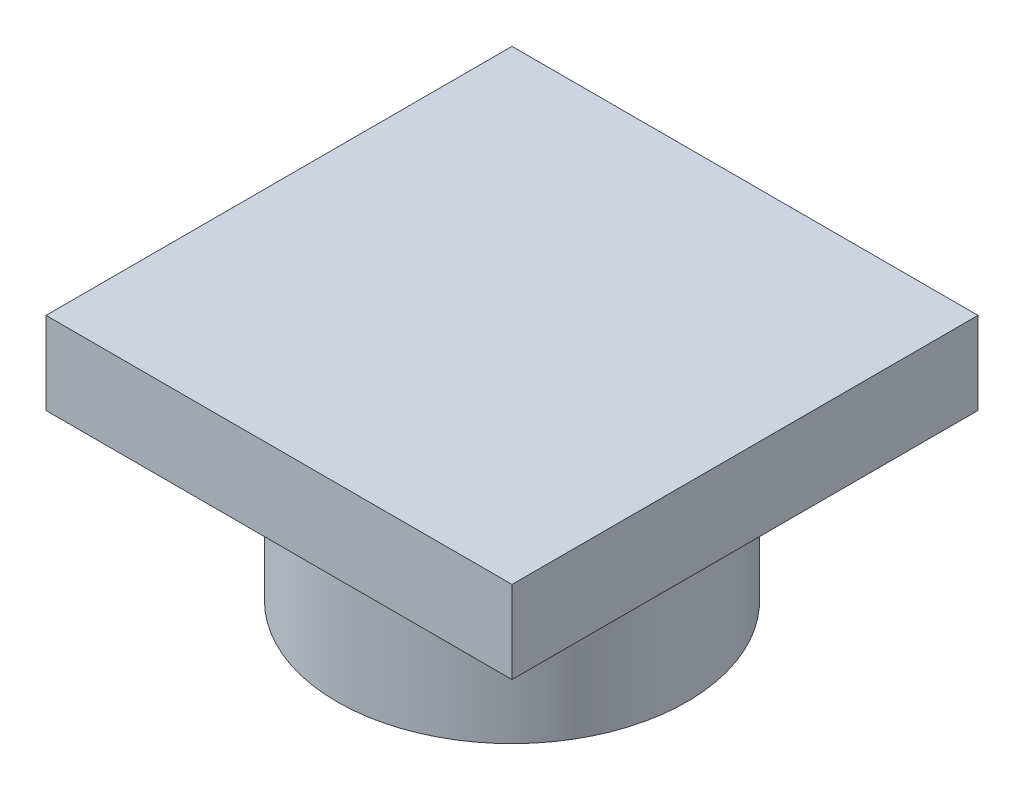
ISO-10303-21;
HEADER;
FILE_DESCRIPTION(('STEP AP214'),'2;1');
FILE_NAME('part.step','',(''),(''),'','','');
FILE_SCHEMA(('AUTOMOTIVE_DESIGN { 1 0 10303 214 1 1 1 1 }'));
ENDSEC;
DATA;
#1=APPLICATION_CONTEXT('core data for automotive mechanical design processes');
#2=APPLICATION_PROTOCOL_DEFINITION('international standard','automotive_design',2000,#1);
#3=PRODUCT_CONTEXT('',#1,'mechanical');
#4=PRODUCT('Part','Part','',(#3));
#5=PRODUCT_RELATED_PRODUCT_CATEGORY('part','',(#4));
#6=PRODUCT_DEFINITION_FORMATION('','',#4);
#7=PRODUCT_DEFINITION_CONTEXT('part definition',#1,'design');
#8=PRODUCT_DEFINITION('design','',#6,#7);
#9=PRODUCT_DEFINITION_SHAPE('','',#8);
#10=(LENGTH_UNIT() NAMED_UNIT(*) SI_UNIT(.MILLI.,.METRE.));
#11=(NAMED_UNIT(*) PLANE_ANGLE_UNIT() SI_UNIT($,.RADIAN.));
#12=(NAMED_UNIT(*) SI_UNIT($,.STERADIAN.) SOLID_ANGLE_UNIT());
#13=UNCERTAINTY_MEASURE_WITH_UNIT(LENGTH_MEASURE(1.E-05),#10,'distance_accuracy_value','');
#14=(GEOMETRIC_REPRESENTATION_CONTEXT(3) GLOBAL_UNCERTAINTY_ASSIGNED_CONTEXT((#13)) GLOBAL_UNIT_ASSIGNED_CONTEXT((#10,
#11,#12)) REPRESENTATION_CONTEXT('',''));
#15=CARTESIAN_POINT('',(0.,0.,0.));
#16=DIRECTION('',(0.,0.,1.));
#17=DIRECTION('',(1.,0.,0.));
#18=AXIS2_PLACEMENT_3D('',#15,#16,#17);
#19=CARTESIAN_POINT('',(0.,4.,0.));
#20=DIRECTION('',(0.,-1.,0.));
#21=DIRECTION('',(0.,0.,-1.));
#22=AXIS2_PLACEMENT_3D('',#19,#20,#21);
#23=CYLINDRICAL_SURFACE('',#22,4.25);
#24=CARTESIAN_POINT('',(0.,4.,0.));
#25=DIRECTION('',(0.,1.,0.));
#26=DIRECTION('',(0.,0.,1.));
#27=AXIS2_PLACEMENT_3D('',#24,#25,#26);
#28=CIRCLE('',#27,4.25);
#29=CARTESIAN_POINT('',(0.,4.,4.25));
#30=VERTEX_POINT('',#29);
#31=EDGE_CURVE('E11',#30,#30,#28,.T.);
#32=ORIENTED_EDGE('',*,*,#31,.F.);
#33=EDGE_LOOP('',(#32));
#34=FACE_BOUND('',#33,.T.);
#35=CARTESIAN_POINT('',(0.,0.,0.));
#36=DIRECTION('',(0.,1.,0.));
#37=DIRECTION('',(0.,0.,1.));
#38=AXIS2_PLACEMENT_3D('',#35,#36,#37);
#39=CIRCLE('',#38,4.25);
#40=CARTESIAN_POINT('',(0.,0.,4.25));
#41=VERTEX_POINT('',#40);
#42=EDGE_CURVE('E44',#41,#41,#39,.T.);
#43=ORIENTED_EDGE('',*,*,#42,.T.);
#44=EDGE_LOOP('',(#43));
#45=FACE_BOUND('',#44,.T.);
#46=ADVANCED_FACE('F41',(#34,#45),#23,.T.);
#47=CARTESIAN_POINT('',(0.,0.,0.));
#48=DIRECTION('',(0.,1.,0.));
#49=DIRECTION('',(0.,0.,1.));
#50=AXIS2_PLACEMENT_3D('',#47,#48,#49);
#51=PLANE('',#50);
#52=ORIENTED_EDGE('',*,*,#42,.F.);
#53=EDGE_LOOP('',(#52));
#54=FACE_BOUND('',#53,.T.);
#55=ADVANCED_FACE('F133',(#54),#51,.F.);
#56=CARTESIAN_POINT('',(0.,6.,5.65685424949241));
#57=DIRECTION('',(0.,0.,-1.));
#58=DIRECTION('',(-1.,0.,0.));
#59=AXIS2_PLACEMENT_3D('',#56,#57,#58);
#60=PLANE('',#59);
#61=DIRECTION('',(1.,0.,0.));
#62=VECTOR('',#61,1.);
#63=CARTESIAN_POINT('',(0.,4.,5.65685424949241));
#64=LINE('',#63,#62);
#65=CARTESIAN_POINT('',(-5.65685424949235,4.,5.65685424949241));
#66=VERTEX_POINT('',#65);
#67=CARTESIAN_POINT('',(5.65685424949238,4.,5.65685424949241));
#68=VERTEX_POINT('',#67);
#69=EDGE_CURVE('E112',#66,#68,#64,.T.);
#70=ORIENTED_EDGE('',*,*,#69,.T.);
#71=DIRECTION('',(0.,-1.,0.));
#72=VECTOR('',#71,1.);
#73=CARTESIAN_POINT('',(5.65685424949238,6.,5.65685424949241));
#74=LINE('',#73,#72);
#75=CARTESIAN_POINT('',(5.65685424949238,6.,5.65685424949241));
#76=VERTEX_POINT('',#75);
#77=EDGE_CURVE('E98',#76,#68,#74,.T.);
#78=ORIENTED_EDGE('',*,*,#77,.F.);
#79=DIRECTION('',(1.,0.,0.));
#80=VECTOR('',#79,1.);
#81=CARTESIAN_POINT('',(0.,6.,5.65685424949241));
#82=LINE('',#81,#80);
#83=CARTESIAN_POINT('',(-5.65685424949235,6.,5.65685424949241));
#84=VERTEX_POINT('',#83);
#85=EDGE_CURVE('E82',#84,#76,#82,.T.);
#86=ORIENTED_EDGE('',*,*,#85,.F.);
#87=DIRECTION('',(0.,-1.,0.));
#88=VECTOR('',#87,1.);
#89=CARTESIAN_POINT('',(-5.65685424949235,6.,5.65685424949241));
#90=LINE('',#89,#88);
#91=EDGE_CURVE('E108',#84,#66,#90,.T.);
#92=ORIENTED_EDGE('',*,*,#91,.T.);
#93=EDGE_LOOP('',(#70,#78,#86,#92));
#94=FACE_BOUND('',#93,.T.);
#95=ADVANCED_FACE('F135',(#94),#60,.F.);
#96=CARTESIAN_POINT('',(5.65685424949238,6.,0.));
#97=DIRECTION('',(1.,0.,0.));
#98=DIRECTION('',(0.,0.,-1.));
#99=AXIS2_PLACEMENT_3D('',#96,#97,#98);
#100=PLANE('',#99);
#101=DIRECTION('',(0.,0.,1.));
#102=VECTOR('',#101,1.);
#103=CARTESIAN_POINT('',(5.65685424949238,4.,0.));
#104=LINE('',#103,#102);
#105=CARTESIAN_POINT('',(5.65685424949238,4.,-5.65685424949238));
#106=VERTEX_POINT('',#105);
#107=EDGE_CURVE('E92',#106,#68,#104,.T.);
#108=ORIENTED_EDGE('',*,*,#107,.F.);
#109=DIRECTION('',(0.,-1.,0.));
#110=VECTOR('',#109,1.);
#111=CARTESIAN_POINT('',(5.65685424949238,6.,-5.65685424949238));
#112=LINE('',#111,#110);
#113=CARTESIAN_POINT('',(5.65685424949238,6.,-5.65685424949238));
#114=VERTEX_POINT('',#113);
#115=EDGE_CURVE('E88',#114,#106,#112,.T.);
#116=ORIENTED_EDGE('',*,*,#115,.F.);
#117=DIRECTION('',(0.,0.,1.));
#118=VECTOR('',#117,1.);
#119=CARTESIAN_POINT('',(5.65685424949238,6.,0.));
#120=LINE('',#119,#118);
#121=EDGE_CURVE('E90',#114,#76,#120,.T.);
#122=ORIENTED_EDGE('',*,*,#121,.T.);
#123=ORIENTED_EDGE('',*,*,#77,.T.);
#124=EDGE_LOOP('',(#108,#116,#122,#123));
#125=FACE_BOUND('',#124,.T.);
#126=ADVANCED_FACE('F89',(#125),#100,.T.);
#127=CARTESIAN_POINT('',(0.,6.,-5.65685424949238));
#128=DIRECTION('',(0.,0.,-1.));
#129=DIRECTION('',(-1.,0.,0.));
#130=AXIS2_PLACEMENT_3D('',#127,#128,#129);
#131=PLANE('',#130);
#132=DIRECTION('',(1.,0.,0.));
#133=VECTOR('',#132,1.);
#134=CARTESIAN_POINT('',(0.,4.,-5.65685424949238));
#135=LINE('',#134,#133);
#136=CARTESIAN_POINT('',(-5.65685424949235,4.,-5.65685424949238));
#137=VERTEX_POINT('',#136);
#138=EDGE_CURVE('E118',#137,#106,#135,.T.);
#139=ORIENTED_EDGE('',*,*,#138,.F.);
#140=DIRECTION('',(0.,-1.,0.));
#141=VECTOR('',#140,1.);
#142=CARTESIAN_POINT('',(-5.65685424949235,6.,-5.65685424949238));
#143=LINE('',#142,#141);
#144=CARTESIAN_POINT('',(-5.65685424949235,6.,-5.65685424949238));
#145=VERTEX_POINT('',#144);
#146=EDGE_CURVE('E74',#145,#137,#143,.T.);
#147=ORIENTED_EDGE('',*,*,#146,.F.);
#148=DIRECTION('',(1.,0.,0.));
#149=VECTOR('',#148,1.);
#150=CARTESIAN_POINT('',(0.,6.,-5.65685424949238));
#151=LINE('',#150,#149);
#152=EDGE_CURVE('E101',#145,#114,#151,.T.);
#153=ORIENTED_EDGE('',*,*,#152,.T.);
#154=ORIENTED_EDGE('',*,*,#115,.T.);
#155=EDGE_LOOP('',(#139,#147,#153,#154));
#156=FACE_BOUND('',#155,.T.);
#157=ADVANCED_FACE('F104',(#156),#131,.T.);
#158=CARTESIAN_POINT('',(-5.65685424949235,6.,0.));
#159=DIRECTION('',(1.,0.,0.));
#160=DIRECTION('',(0.,0.,-1.));
#161=AXIS2_PLACEMENT_3D('',#158,#159,#160);
#162=PLANE('',#161);
#163=DIRECTION('',(0.,0.,1.));
#164=VECTOR('',#163,1.);
#165=CARTESIAN_POINT('',(-5.65685424949235,4.,0.));
#166=LINE('',#165,#164);
#167=EDGE_CURVE('E77',#137,#66,#166,.T.);
#168=ORIENTED_EDGE('',*,*,#167,.T.);
#169=ORIENTED_EDGE('',*,*,#91,.F.);
#170=DIRECTION('',(0.,0.,1.));
#171=VECTOR('',#170,1.);
#172=CARTESIAN_POINT('',(-5.65685424949235,6.,0.));
#173=LINE('',#172,#171);
#174=EDGE_CURVE('E58',#145,#84,#173,.T.);
#175=ORIENTED_EDGE('',*,*,#174,.F.);
#176=ORIENTED_EDGE('',*,*,#146,.T.);
#177=EDGE_LOOP('',(#168,#169,#175,#176));
#178=FACE_BOUND('',#177,.T.);
#179=ADVANCED_FACE('F148',(#178),#162,.F.);
#180=CARTESIAN_POINT('',(0.,6.,0.));
#181=DIRECTION('',(0.,1.,0.));
#182=DIRECTION('',(0.,0.,1.));
#183=AXIS2_PLACEMENT_3D('',#180,#181,#182);
#184=PLANE('',#183);
#185=ORIENTED_EDGE('',*,*,#85,.T.);
#186=ORIENTED_EDGE('',*,*,#121,.F.);
#187=ORIENTED_EDGE('',*,*,#152,.F.);
#188=ORIENTED_EDGE('',*,*,#174,.T.);
#189=EDGE_LOOP('',(#185,#186,#187,#188));
#190=FACE_BOUND('',#189,.T.);
#191=ADVANCED_FACE('F100',(#190),#184,.T.);
#192=CARTESIAN_POINT('',(0.,4.,0.));
#193=DIRECTION('',(0.,1.,0.));
#194=DIRECTION('',(0.,0.,1.));
#195=AXIS2_PLACEMENT_3D('',#192,#193,#194);
#196=PLANE('',#195);
#197=ORIENTED_EDGE('',*,*,#31,.T.);
#198=EDGE_LOOP('',(#197));
#199=FACE_BOUND('',#198,.T.);
#200=ORIENTED_EDGE('',*,*,#69,.F.);
#201=ORIENTED_EDGE('',*,*,#167,.F.);
#202=ORIENTED_EDGE('',*,*,#138,.T.);
#203=ORIENTED_EDGE('',*,*,#107,.T.);
#204=EDGE_LOOP('',(#200,#201,#202,#203));
#205=FACE_BOUND('',#204,.T.);
#206=ADVANCED_FACE('F151',(#199,#205),#196,.F.);
#207=CLOSED_SHELL('',(#46,#55,#95,#126,#157,#179,#191,#206));
#208=MANIFOLD_SOLID_BREP('B2',#207);
#209=ADVANCED_BREP_SHAPE_REPRESENTATION('',(#18,#208),#14);
#210=SHAPE_DEFINITION_REPRESENTATION(#9,#209);
ENDSEC;
END-ISO-10303-21;
